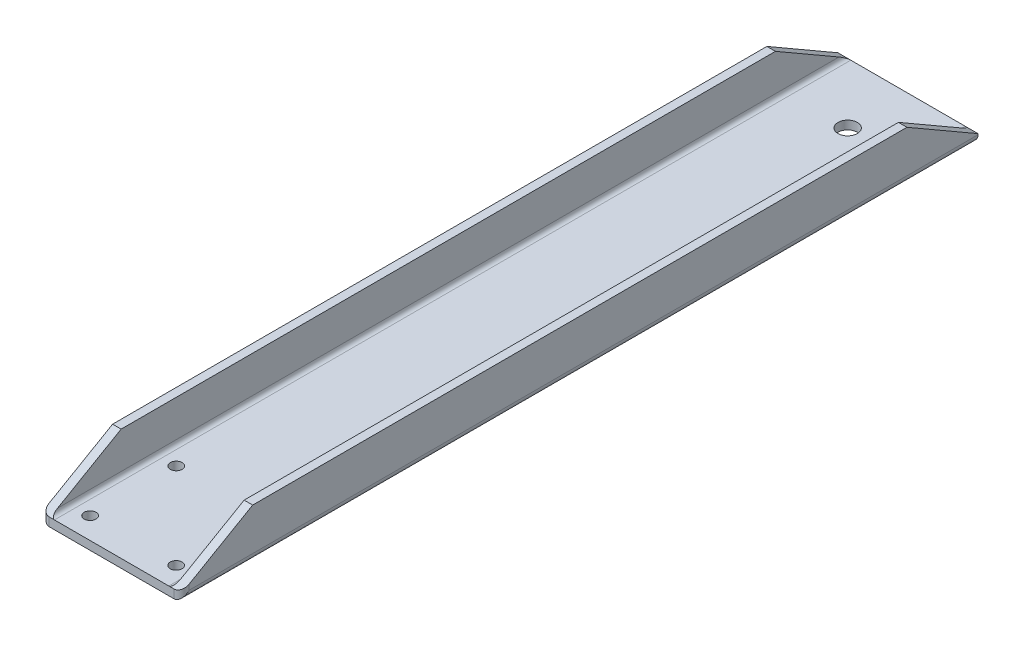
ISO-10303-21;
HEADER;
FILE_DESCRIPTION(('STEP AP214'),'2;1');
FILE_NAME('part.step','',(''),(''),'','','');
FILE_SCHEMA(('AUTOMOTIVE_DESIGN { 1 0 10303 214 1 1 1 1 }'));
ENDSEC;
DATA;
#1=APPLICATION_CONTEXT('core data for automotive mechanical design processes');
#2=APPLICATION_PROTOCOL_DEFINITION('international standard','automotive_design',2000,#1);
#3=PRODUCT_CONTEXT('',#1,'mechanical');
#4=PRODUCT('Part','Part','',(#3));
#5=PRODUCT_RELATED_PRODUCT_CATEGORY('part','',(#4));
#6=PRODUCT_DEFINITION_FORMATION('','',#4);
#7=PRODUCT_DEFINITION_CONTEXT('part definition',#1,'design');
#8=PRODUCT_DEFINITION('design','',#6,#7);
#9=PRODUCT_DEFINITION_SHAPE('','',#8);
#10=(LENGTH_UNIT() NAMED_UNIT(*) SI_UNIT(.MILLI.,.METRE.));
#11=(NAMED_UNIT(*) PLANE_ANGLE_UNIT() SI_UNIT($,.RADIAN.));
#12=(NAMED_UNIT(*) SI_UNIT($,.STERADIAN.) SOLID_ANGLE_UNIT());
#13=UNCERTAINTY_MEASURE_WITH_UNIT(LENGTH_MEASURE(1.E-05),#10,'distance_accuracy_value','');
#14=(GEOMETRIC_REPRESENTATION_CONTEXT(3) GLOBAL_UNCERTAINTY_ASSIGNED_CONTEXT((#13)) GLOBAL_UNIT_ASSIGNED_CONTEXT((#10,
#11,#12)) REPRESENTATION_CONTEXT('',''));
#15=CARTESIAN_POINT('',(0.,0.,0.));
#16=DIRECTION('',(0.,0.,1.));
#17=DIRECTION('',(1.,0.,0.));
#18=AXIS2_PLACEMENT_3D('',#15,#16,#17);
#19=CARTESIAN_POINT('',(32.54375,0.,370.));
#20=DIRECTION('',(-1.,0.,0.));
#21=DIRECTION('',(0.,0.,1.));
#22=AXIS2_PLACEMENT_3D('',#19,#20,#21);
#23=PLANE('',#22);
#24=DIRECTION('',(0.,-1.,0.));
#25=VECTOR('',#24,1.);
#26=CARTESIAN_POINT('',(32.54375,23.01875,366.5));
#27=LINE('',#26,#25);
#28=CARTESIAN_POINT('',(32.54375,5.9894759421637,366.5));
#29=VERTEX_POINT('',#28);
#30=CARTESIAN_POINT('',(32.54375,3.5,366.5));
#31=VERTEX_POINT('',#30);
#32=EDGE_CURVE('E140',#29,#31,#27,.T.);
#33=ORIENTED_EDGE('',*,*,#32,.T.);
#34=DIRECTION('',(0.,0.,-1.));
#35=VECTOR('',#34,1.);
#36=CARTESIAN_POINT('',(32.54375,3.5,370.));
#37=LINE('',#36,#35);
#38=CARTESIAN_POINT('',(32.54375,3.5,0.));
#39=VERTEX_POINT('',#38);
#40=EDGE_CURVE('E241',#31,#39,#37,.T.);
#41=ORIENTED_EDGE('',*,*,#40,.T.);
#42=DIRECTION('',(0.,1.,0.));
#43=VECTOR('',#42,1.);
#44=CARTESIAN_POINT('',(32.54375,0.,0.));
#45=LINE('',#44,#43);
#46=CARTESIAN_POINT('',(32.54375,3.96874999999999,0.));
#47=VERTEX_POINT('',#46);
#48=EDGE_CURVE('E198',#39,#47,#45,.T.);
#49=ORIENTED_EDGE('',*,*,#48,.T.);
#50=DIRECTION('',(0.,0.499999999999995,0.866025403784441));
#51=VECTOR('',#50,1.);
#52=CARTESIAN_POINT('',(32.54375,3.96874999999999,0.));
#53=LINE('',#52,#51);
#54=CARTESIAN_POINT('',(32.54375,23.01875,32.9955678841875));
#55=VERTEX_POINT('',#54);
#56=EDGE_CURVE('E177',#47,#55,#53,.T.);
#57=ORIENTED_EDGE('',*,*,#56,.T.);
#58=DIRECTION('',(0.,0.,-1.));
#59=VECTOR('',#58,1.);
#60=CARTESIAN_POINT('',(32.54375,23.01875,370.));
#61=LINE('',#60,#59);
#62=CARTESIAN_POINT('',(32.54375,23.01875,337.004432115813));
#63=VERTEX_POINT('',#62);
#64=EDGE_CURVE('E159',#63,#55,#61,.T.);
#65=ORIENTED_EDGE('',*,*,#64,.F.);
#66=DIRECTION('',(0.,-0.499999999999995,0.866025403784441));
#67=VECTOR('',#66,1.);
#68=CARTESIAN_POINT('',(32.54375,3.96875000000004,370.));
#69=LINE('',#68,#67);
#70=EDGE_CURVE('E152',#63,#29,#69,.T.);
#71=ORIENTED_EDGE('',*,*,#70,.T.);
#72=EDGE_LOOP('',(#33,#41,#49,#57,#65,#71));
#73=FACE_BOUND('',#72,.T.);
#74=ADVANCED_FACE('F36',(#73),#23,.F.);
#75=CARTESIAN_POINT('',(0.,0.,370.));
#76=DIRECTION('',(0.,0.,1.));
#77=DIRECTION('',(1.,0.,0.));
#78=AXIS2_PLACEMENT_3D('',#75,#76,#77);
#79=PLANE('',#78);
#80=DIRECTION('',(1.,0.,0.));
#81=VECTOR('',#80,1.);
#82=CARTESIAN_POINT('',(0.,0.,370.));
#83=LINE('',#82,#81);
#84=CARTESIAN_POINT('',(-29.04375,0.,370.));
#85=VERTEX_POINT('',#84);
#86=CARTESIAN_POINT('',(29.04375,0.,370.));
#87=VERTEX_POINT('',#86);
#88=EDGE_CURVE('E197',#85,#87,#83,.T.);
#89=ORIENTED_EDGE('',*,*,#88,.T.);
#90=DIRECTION('',(0.,-1.,0.));
#91=VECTOR('',#90,1.);
#92=CARTESIAN_POINT('',(29.04375,23.01875,370.));
#93=LINE('',#92,#91);
#94=CARTESIAN_POINT('',(29.04375,3.96875000000004,370.));
#95=VERTEX_POINT('',#94);
#96=EDGE_CURVE('E58',#95,#87,#93,.T.);
#97=ORIENTED_EDGE('',*,*,#96,.F.);
#98=DIRECTION('',(-1.,0.,0.));
#99=VECTOR('',#98,1.);
#100=CARTESIAN_POINT('',(32.54375,3.96875000000004,370.));
#101=LINE('',#100,#99);
#102=CARTESIAN_POINT('',(26.575,3.96874999999999,370.));
#103=VERTEX_POINT('',#102);
#104=EDGE_CURVE('E155',#95,#103,#101,.T.);
#105=ORIENTED_EDGE('',*,*,#104,.T.);
#106=DIRECTION('',(-1.,0.,0.));
#107=VECTOR('',#106,1.);
#108=CARTESIAN_POINT('',(0.,3.96874999999999,370.));
#109=LINE('',#108,#107);
#110=CARTESIAN_POINT('',(-26.575,3.96875000000004,370.));
#111=VERTEX_POINT('',#110);
#112=EDGE_CURVE('E194',#103,#111,#109,.T.);
#113=ORIENTED_EDGE('',*,*,#112,.T.);
#114=DIRECTION('',(1.,0.,0.));
#115=VECTOR('',#114,1.);
#116=CARTESIAN_POINT('',(0.,3.96875000000004,370.));
#117=LINE('',#116,#115);
#118=CARTESIAN_POINT('',(-29.04375,3.96875000000004,370.));
#119=VERTEX_POINT('',#118);
#120=EDGE_CURVE('E219',#119,#111,#117,.T.);
#121=ORIENTED_EDGE('',*,*,#120,.F.);
#122=DIRECTION('',(0.,-1.,0.));
#123=VECTOR('',#122,1.);
#124=CARTESIAN_POINT('',(-29.04375,23.01875,370.));
#125=LINE('',#124,#123);
#126=EDGE_CURVE('E257',#119,#85,#125,.T.);
#127=ORIENTED_EDGE('',*,*,#126,.T.);
#128=EDGE_LOOP('',(#89,#97,#105,#113,#121,#127));
#129=FACE_BOUND('',#128,.T.);
#130=ADVANCED_FACE('F265',(#129),#79,.T.);
#131=CARTESIAN_POINT('',(0.,3.96874999999999,370.));
#132=DIRECTION('',(0.,-1.,0.));
#133=DIRECTION('',(0.,0.,-1.));
#134=AXIS2_PLACEMENT_3D('',#131,#132,#133);
#135=PLANE('',#134);
#136=CARTESIAN_POINT('',(0.,3.96874999999999,28.));
#137=DIRECTION('',(0.,1.,0.));
#138=DIRECTION('',(0.,0.,1.));
#139=AXIS2_PLACEMENT_3D('',#136,#137,#138);
#140=CIRCLE('',#139,4.5);
#141=CARTESIAN_POINT('',(0.,3.96874999999999,32.5));
#142=VERTEX_POINT('',#141);
#143=EDGE_CURVE('E307',#142,#142,#140,.T.);
#144=ORIENTED_EDGE('',*,*,#143,.F.);
#145=EDGE_LOOP('',(#144));
#146=FACE_BOUND('',#145,.T.);
#147=CARTESIAN_POINT('',(20.,3.96874999999999,360.));
#148=DIRECTION('',(0.,1.,0.));
#149=DIRECTION('',(0.,0.,1.));
#150=AXIS2_PLACEMENT_3D('',#147,#148,#149);
#151=CIRCLE('',#150,2.74999999999999);
#152=CARTESIAN_POINT('',(20.,3.96874999999999,362.75));
#153=VERTEX_POINT('',#152);
#154=EDGE_CURVE('E313',#153,#153,#151,.T.);
#155=ORIENTED_EDGE('',*,*,#154,.F.);
#156=EDGE_LOOP('',(#155));
#157=FACE_BOUND('',#156,.T.);
#158=CARTESIAN_POINT('',(20.,3.96874999999999,320.));
#159=DIRECTION('',(0.,1.,0.));
#160=DIRECTION('',(0.,0.,1.));
#161=AXIS2_PLACEMENT_3D('',#158,#159,#160);
#162=CIRCLE('',#161,2.74999999999999);
#163=CARTESIAN_POINT('',(20.,3.96874999999999,322.75));
#164=VERTEX_POINT('',#163);
#165=EDGE_CURVE('E319',#164,#164,#162,.T.);
#166=ORIENTED_EDGE('',*,*,#165,.F.);
#167=EDGE_LOOP('',(#166));
#168=FACE_BOUND('',#167,.T.);
#169=CARTESIAN_POINT('',(-20.,3.96874999999999,320.));
#170=DIRECTION('',(0.,1.,0.));
#171=DIRECTION('',(0.,0.,1.));
#172=AXIS2_PLACEMENT_3D('',#169,#170,#171);
#173=CIRCLE('',#172,2.74999999999999);
#174=CARTESIAN_POINT('',(-20.,3.96874999999999,322.75));
#175=VERTEX_POINT('',#174);
#176=EDGE_CURVE('E325',#175,#175,#173,.T.);
#177=ORIENTED_EDGE('',*,*,#176,.F.);
#178=EDGE_LOOP('',(#177));
#179=FACE_BOUND('',#178,.T.);
#180=ORIENTED_EDGE('',*,*,#112,.F.);
#181=DIRECTION('',(0.,0.,-1.));
#182=VECTOR('',#181,1.);
#183=CARTESIAN_POINT('',(26.575,3.96874999999999,0.));
#184=LINE('',#183,#182);
#185=CARTESIAN_POINT('',(26.575,3.96874999999999,0.));
#186=VERTEX_POINT('',#185);
#187=EDGE_CURVE('E224',#103,#186,#184,.T.);
#188=ORIENTED_EDGE('',*,*,#187,.T.);
#189=DIRECTION('',(-1.,0.,0.));
#190=VECTOR('',#189,1.);
#191=CARTESIAN_POINT('',(0.,3.96874999999999,0.));
#192=LINE('',#191,#190);
#193=CARTESIAN_POINT('',(-26.575,3.96874999999999,0.));
#194=VERTEX_POINT('',#193);
#195=EDGE_CURVE('E193',#186,#194,#192,.T.);
#196=ORIENTED_EDGE('',*,*,#195,.T.);
#197=DIRECTION('',(0.,0.,-1.));
#198=VECTOR('',#197,1.);
#199=CARTESIAN_POINT('',(-26.575,3.96874999999999,370.));
#200=LINE('',#199,#198);
#201=EDGE_CURVE('E221',#194,#111,#200,.F.);
#202=ORIENTED_EDGE('',*,*,#201,.T.);
#203=EDGE_LOOP('',(#180,#188,#196,#202));
#204=FACE_BOUND('',#203,.T.);
#205=CARTESIAN_POINT('',(-20.,3.96874999999999,360.));
#206=DIRECTION('',(0.,1.,0.));
#207=DIRECTION('',(0.,0.,1.));
#208=AXIS2_PLACEMENT_3D('',#205,#206,#207);
#209=CIRCLE('',#208,2.74999999999999);
#210=CARTESIAN_POINT('',(-20.,3.96874999999999,362.75));
#211=VERTEX_POINT('',#210);
#212=EDGE_CURVE('E330',#211,#211,#209,.T.);
#213=ORIENTED_EDGE('',*,*,#212,.F.);
#214=EDGE_LOOP('',(#213));
#215=FACE_BOUND('',#214,.T.);
#216=ADVANCED_FACE('F300',(#146,#157,#168,#179,#204,#215),#135,.F.);
#217=CARTESIAN_POINT('',(-28.575,0.,370.));
#218=DIRECTION('',(1.,0.,0.));
#219=DIRECTION('',(0.,1.,0.));
#220=AXIS2_PLACEMENT_3D('',#217,#218,#219);
#221=PLANE('',#220);
#222=DIRECTION('',(0.,0.499999999999995,-0.866025403784441));
#223=VECTOR('',#222,1.);
#224=CARTESIAN_POINT('',(-28.575,2.97656250000005,371.718519160635));
#225=LINE('',#224,#223);
#226=CARTESIAN_POINT('',(-28.575,5.96874999999999,366.535898384862));
#227=VERTEX_POINT('',#226);
#228=CARTESIAN_POINT('',(-28.575,23.01875,337.004432115813));
#229=VERTEX_POINT('',#228);
#230=EDGE_CURVE('E174',#227,#229,#225,.T.);
#231=ORIENTED_EDGE('',*,*,#230,.F.);
#232=DIRECTION('',(0.,0.,-1.));
#233=VECTOR('',#232,1.);
#234=CARTESIAN_POINT('',(-28.575,5.96874999999999,370.));
#235=LINE('',#234,#233);
#236=CARTESIAN_POINT('',(-28.575,5.96874999999997,3.46410161513772));
#237=VERTEX_POINT('',#236);
#238=EDGE_CURVE('E229',#227,#237,#235,.T.);
#239=ORIENTED_EDGE('',*,*,#238,.T.);
#240=DIRECTION('',(0.,-0.499999999999995,-0.866025403784441));
#241=VECTOR('',#240,1.);
#242=CARTESIAN_POINT('',(-28.575,163.19126220012,275.781480839367));
#243=LINE('',#242,#241);
#244=CARTESIAN_POINT('',(-28.575,23.01875,32.9955678841875));
#245=VERTEX_POINT('',#244);
#246=EDGE_CURVE('E190',#245,#237,#243,.T.);
#247=ORIENTED_EDGE('',*,*,#246,.F.);
#248=DIRECTION('',(0.,0.,-1.));
#249=VECTOR('',#248,1.);
#250=CARTESIAN_POINT('',(-28.575,23.01875,370.));
#251=LINE('',#250,#249);
#252=EDGE_CURVE('E215',#229,#245,#251,.T.);
#253=ORIENTED_EDGE('',*,*,#252,.F.);
#254=EDGE_LOOP('',(#231,#239,#247,#253));
#255=FACE_BOUND('',#254,.T.);
#256=ADVANCED_FACE('F292',(#255),#221,.T.);
#257=CARTESIAN_POINT('',(0.,23.01875,370.));
#258=DIRECTION('',(0.,1.,0.));
#259=DIRECTION('',(0.,0.,1.));
#260=AXIS2_PLACEMENT_3D('',#257,#258,#259);
#261=PLANE('',#260);
#262=DIRECTION('',(-1.,0.,0.));
#263=VECTOR('',#262,1.);
#264=CARTESIAN_POINT('',(32.54375,23.01875,337.004432115813));
#265=LINE('',#264,#263);
#266=CARTESIAN_POINT('',(-32.54375,23.01875,337.004432115813));
#267=VERTEX_POINT('',#266);
#268=EDGE_CURVE('E160',#229,#267,#265,.T.);
#269=ORIENTED_EDGE('',*,*,#268,.F.);
#270=ORIENTED_EDGE('',*,*,#252,.T.);
#271=DIRECTION('',(-1.,0.,0.));
#272=VECTOR('',#271,1.);
#273=CARTESIAN_POINT('',(32.54375,23.01875,32.9955678841875));
#274=LINE('',#273,#272);
#275=CARTESIAN_POINT('',(-32.54375,23.01875,32.9955678841875));
#276=VERTEX_POINT('',#275);
#277=EDGE_CURVE('E186',#245,#276,#274,.T.);
#278=ORIENTED_EDGE('',*,*,#277,.T.);
#279=DIRECTION('',(0.,0.,-1.));
#280=VECTOR('',#279,1.);
#281=CARTESIAN_POINT('',(-32.54375,23.01875,370.));
#282=LINE('',#281,#280);
#283=EDGE_CURVE('E213',#267,#276,#282,.T.);
#284=ORIENTED_EDGE('',*,*,#283,.F.);
#285=EDGE_LOOP('',(#269,#270,#278,#284));
#286=FACE_BOUND('',#285,.T.);
#287=ADVANCED_FACE('F288',(#286),#261,.T.);
#288=CARTESIAN_POINT('',(-32.54375,0.,370.));
#289=DIRECTION('',(1.,0.,0.));
#290=DIRECTION('',(0.,0.,-1.));
#291=AXIS2_PLACEMENT_3D('',#288,#289,#290);
#292=PLANE('',#291);
#293=DIRECTION('',(0.,0.,-1.));
#294=VECTOR('',#293,1.);
#295=CARTESIAN_POINT('',(-32.54375,3.5,370.));
#296=LINE('',#295,#294);
#297=CARTESIAN_POINT('',(-32.54375,3.5,0.));
#298=VERTEX_POINT('',#297);
#299=CARTESIAN_POINT('',(-32.54375,3.5,366.5));
#300=VERTEX_POINT('',#299);
#301=EDGE_CURVE('E253',#298,#300,#296,.F.);
#302=ORIENTED_EDGE('',*,*,#301,.T.);
#303=DIRECTION('',(0.,-1.,0.));
#304=VECTOR('',#303,1.);
#305=CARTESIAN_POINT('',(-32.54375,23.01875,366.5));
#306=LINE('',#305,#304);
#307=CARTESIAN_POINT('',(-32.54375,5.98947594216371,366.5));
#308=VERTEX_POINT('',#307);
#309=EDGE_CURVE('E51',#308,#300,#306,.T.);
#310=ORIENTED_EDGE('',*,*,#309,.F.);
#311=DIRECTION('',(0.,-0.499999999999995,0.866025403784441));
#312=VECTOR('',#311,1.);
#313=CARTESIAN_POINT('',(-32.54375,3.96875000000004,370.));
#314=LINE('',#313,#312);
#315=EDGE_CURVE('E161',#267,#308,#314,.T.);
#316=ORIENTED_EDGE('',*,*,#315,.F.);
#317=ORIENTED_EDGE('',*,*,#283,.T.);
#318=DIRECTION('',(0.,0.499999999999995,0.866025403784441));
#319=VECTOR('',#318,1.);
#320=CARTESIAN_POINT('',(-32.54375,3.96874999999999,0.));
#321=LINE('',#320,#319);
#322=CARTESIAN_POINT('',(-32.54375,3.96874999999999,0.));
#323=VERTEX_POINT('',#322);
#324=EDGE_CURVE('E176',#323,#276,#321,.T.);
#325=ORIENTED_EDGE('',*,*,#324,.F.);
#326=DIRECTION('',(0.,-1.,0.));
#327=VECTOR('',#326,1.);
#328=CARTESIAN_POINT('',(-32.54375,0.,0.));
#329=LINE('',#328,#327);
#330=EDGE_CURVE('E204',#323,#298,#329,.T.);
#331=ORIENTED_EDGE('',*,*,#330,.T.);
#332=EDGE_LOOP('',(#302,#310,#316,#317,#325,#331));
#333=FACE_BOUND('',#332,.T.);
#334=ADVANCED_FACE('F278',(#333),#292,.F.);
#335=CARTESIAN_POINT('',(0.,0.,370.));
#336=DIRECTION('',(0.,1.,0.));
#337=DIRECTION('',(0.,0.,1.));
#338=AXIS2_PLACEMENT_3D('',#335,#336,#337);
#339=PLANE('',#338);
#340=CARTESIAN_POINT('',(0.,0.,28.));
#341=DIRECTION('',(0.,1.,0.));
#342=DIRECTION('',(0.,0.,1.));
#343=AXIS2_PLACEMENT_3D('',#340,#341,#342);
#344=CIRCLE('',#343,4.5);
#345=CARTESIAN_POINT('',(0.,0.,32.5));
#346=VERTEX_POINT('',#345);
#347=EDGE_CURVE('E310',#346,#346,#344,.T.);
#348=ORIENTED_EDGE('',*,*,#347,.T.);
#349=EDGE_LOOP('',(#348));
#350=FACE_BOUND('',#349,.T.);
#351=CARTESIAN_POINT('',(20.,0.,360.));
#352=DIRECTION('',(0.,1.,0.));
#353=DIRECTION('',(0.,0.,1.));
#354=AXIS2_PLACEMENT_3D('',#351,#352,#353);
#355=CIRCLE('',#354,2.75);
#356=CARTESIAN_POINT('',(20.,0.,362.75));
#357=VERTEX_POINT('',#356);
#358=EDGE_CURVE('E316',#357,#357,#355,.T.);
#359=ORIENTED_EDGE('',*,*,#358,.T.);
#360=EDGE_LOOP('',(#359));
#361=FACE_BOUND('',#360,.T.);
#362=CARTESIAN_POINT('',(20.,0.,320.));
#363=DIRECTION('',(0.,1.,0.));
#364=DIRECTION('',(0.,0.,1.));
#365=AXIS2_PLACEMENT_3D('',#362,#363,#364);
#366=CIRCLE('',#365,2.75);
#367=CARTESIAN_POINT('',(20.,0.,322.75));
#368=VERTEX_POINT('',#367);
#369=EDGE_CURVE('E322',#368,#368,#366,.T.);
#370=ORIENTED_EDGE('',*,*,#369,.T.);
#371=EDGE_LOOP('',(#370));
#372=FACE_BOUND('',#371,.T.);
#373=CARTESIAN_POINT('',(-20.,0.,320.));
#374=DIRECTION('',(0.,1.,0.));
#375=DIRECTION('',(0.,0.,1.));
#376=AXIS2_PLACEMENT_3D('',#373,#374,#375);
#377=CIRCLE('',#376,2.75);
#378=CARTESIAN_POINT('',(-20.,0.,322.75));
#379=VERTEX_POINT('',#378);
#380=EDGE_CURVE('E328',#379,#379,#377,.T.);
#381=ORIENTED_EDGE('',*,*,#380,.T.);
#382=EDGE_LOOP('',(#381));
#383=FACE_BOUND('',#382,.T.);
#384=CARTESIAN_POINT('',(-20.,0.,360.));
#385=DIRECTION('',(0.,1.,0.));
#386=DIRECTION('',(0.,0.,1.));
#387=AXIS2_PLACEMENT_3D('',#384,#385,#386);
#388=CIRCLE('',#387,2.75);
#389=CARTESIAN_POINT('',(-20.,0.,362.75));
#390=VERTEX_POINT('',#389);
#391=EDGE_CURVE('E166',#390,#390,#388,.T.);
#392=ORIENTED_EDGE('',*,*,#391,.T.);
#393=EDGE_LOOP('',(#392));
#394=FACE_BOUND('',#393,.T.);
#395=DIRECTION('',(1.,0.,0.));
#396=VECTOR('',#395,1.);
#397=CARTESIAN_POINT('',(0.,0.,0.));
#398=LINE('',#397,#396);
#399=CARTESIAN_POINT('',(-29.04375,0.,0.));
#400=VERTEX_POINT('',#399);
#401=CARTESIAN_POINT('',(29.04375,0.,0.));
#402=VERTEX_POINT('',#401);
#403=EDGE_CURVE('E207',#400,#402,#398,.T.);
#404=ORIENTED_EDGE('',*,*,#403,.T.);
#405=DIRECTION('',(0.,0.,-1.));
#406=VECTOR('',#405,1.);
#407=CARTESIAN_POINT('',(29.04375,0.,370.));
#408=LINE('',#407,#406);
#409=EDGE_CURVE('E250',#402,#87,#408,.F.);
#410=ORIENTED_EDGE('',*,*,#409,.T.);
#411=ORIENTED_EDGE('',*,*,#88,.F.);
#412=DIRECTION('',(0.,0.,-1.));
#413=VECTOR('',#412,1.);
#414=CARTESIAN_POINT('',(-29.04375,0.,370.));
#415=LINE('',#414,#413);
#416=EDGE_CURVE('E247',#85,#400,#415,.T.);
#417=ORIENTED_EDGE('',*,*,#416,.T.);
#418=EDGE_LOOP('',(#404,#410,#411,#417));
#419=FACE_BOUND('',#418,.T.);
#420=ADVANCED_FACE('F269',(#350,#361,#372,#383,#394,#419),#339,.F.);
#421=CARTESIAN_POINT('',(0.,23.01875,370.));
#422=DIRECTION('',(0.,-1.,0.));
#423=DIRECTION('',(0.,0.,-1.));
#424=AXIS2_PLACEMENT_3D('',#421,#422,#423);
#425=PLANE('',#424);
#426=DIRECTION('',(0.,0.,-1.));
#427=VECTOR('',#426,1.);
#428=CARTESIAN_POINT('',(28.575,23.01875,370.));
#429=LINE('',#428,#427);
#430=CARTESIAN_POINT('',(28.575,23.01875,337.004432115813));
#431=VERTEX_POINT('',#430);
#432=CARTESIAN_POINT('',(28.575,23.01875,32.9955678841875));
#433=VERTEX_POINT('',#432);
#434=EDGE_CURVE('E201',#431,#433,#429,.T.);
#435=ORIENTED_EDGE('',*,*,#434,.F.);
#436=EDGE_CURVE('E163',#63,#431,#265,.T.);
#437=ORIENTED_EDGE('',*,*,#436,.F.);
#438=ORIENTED_EDGE('',*,*,#64,.T.);
#439=EDGE_CURVE('E182',#55,#433,#274,.T.);
#440=ORIENTED_EDGE('',*,*,#439,.T.);
#441=EDGE_LOOP('',(#435,#437,#438,#440));
#442=FACE_BOUND('',#441,.T.);
#443=ADVANCED_FACE('F360',(#442),#425,.F.);
#444=CARTESIAN_POINT('',(28.575,0.,370.));
#445=DIRECTION('',(1.,0.,0.));
#446=DIRECTION('',(0.,1.,0.));
#447=AXIS2_PLACEMENT_3D('',#444,#445,#446);
#448=PLANE('',#447);
#449=DIRECTION('',(0.,-0.499999999999995,-0.866025403784441));
#450=VECTOR('',#449,1.);
#451=CARTESIAN_POINT('',(28.575,163.19126220012,275.781480839367));
#452=LINE('',#451,#450);
#453=CARTESIAN_POINT('',(28.575,5.96874999999997,3.46410161513772));
#454=VERTEX_POINT('',#453);
#455=EDGE_CURVE('E185',#433,#454,#452,.T.);
#456=ORIENTED_EDGE('',*,*,#455,.T.);
#457=DIRECTION('',(0.,0.,-1.));
#458=VECTOR('',#457,1.);
#459=CARTESIAN_POINT('',(28.575,5.96874999999999,370.));
#460=LINE('',#459,#458);
#461=CARTESIAN_POINT('',(28.575,5.96874999999999,366.535898384862));
#462=VERTEX_POINT('',#461);
#463=EDGE_CURVE('E227',#454,#462,#460,.F.);
#464=ORIENTED_EDGE('',*,*,#463,.T.);
#465=DIRECTION('',(0.,0.499999999999995,-0.866025403784441));
#466=VECTOR('',#465,1.);
#467=CARTESIAN_POINT('',(28.575,2.97656250000005,371.718519160635));
#468=LINE('',#467,#466);
#469=EDGE_CURVE('E171',#462,#431,#468,.T.);
#470=ORIENTED_EDGE('',*,*,#469,.T.);
#471=ORIENTED_EDGE('',*,*,#434,.T.);
#472=EDGE_LOOP('',(#456,#464,#470,#471));
#473=FACE_BOUND('',#472,.T.);
#474=ADVANCED_FACE('F401',(#473),#448,.F.);
#475=CARTESIAN_POINT('',(0.,0.,0.));
#476=DIRECTION('',(0.,0.,1.));
#477=DIRECTION('',(1.,0.,0.));
#478=AXIS2_PLACEMENT_3D('',#475,#476,#477);
#479=PLANE('',#478);
#480=ORIENTED_EDGE('',*,*,#48,.F.);
#481=CARTESIAN_POINT('',(29.04375,3.5,0.));
#482=DIRECTION('',(0.,0.,1.));
#483=DIRECTION('',(1.,0.,0.));
#484=AXIS2_PLACEMENT_3D('',#481,#482,#483);
#485=CIRCLE('',#484,3.5);
#486=EDGE_CURVE('E245',#39,#402,#485,.F.);
#487=ORIENTED_EDGE('',*,*,#486,.T.);
#488=ORIENTED_EDGE('',*,*,#403,.F.);
#489=CARTESIAN_POINT('',(-29.04375,3.5,0.));
#490=DIRECTION('',(0.,0.,1.));
#491=DIRECTION('',(1.,0.,0.));
#492=AXIS2_PLACEMENT_3D('',#489,#490,#491);
#493=CIRCLE('',#492,3.5);
#494=EDGE_CURVE('E243',#400,#298,#493,.F.);
#495=ORIENTED_EDGE('',*,*,#494,.T.);
#496=ORIENTED_EDGE('',*,*,#330,.F.);
#497=DIRECTION('',(1.,0.,0.));
#498=VECTOR('',#497,1.);
#499=CARTESIAN_POINT('',(0.,3.96874999999999,0.));
#500=LINE('',#499,#498);
#501=EDGE_CURVE('E217',#323,#194,#500,.T.);
#502=ORIENTED_EDGE('',*,*,#501,.T.);
#503=ORIENTED_EDGE('',*,*,#195,.F.);
#504=DIRECTION('',(-1.,0.,0.));
#505=VECTOR('',#504,1.);
#506=CARTESIAN_POINT('',(32.54375,3.96874999999999,0.));
#507=LINE('',#506,#505);
#508=EDGE_CURVE('E179',#47,#186,#507,.T.);
#509=ORIENTED_EDGE('',*,*,#508,.F.);
#510=EDGE_LOOP('',(#480,#487,#488,#495,#496,#502,#503,#509));
#511=FACE_BOUND('',#510,.T.);
#512=ADVANCED_FACE('F275',(#511),#479,.F.);
#513=CARTESIAN_POINT('',(32.54375,3.96874999999999,0.));
#514=DIRECTION('',(0.,-0.866025403784441,0.499999999999995));
#515=DIRECTION('',(0.,-0.499999999999995,-0.866025403784441));
#516=AXIS2_PLACEMENT_3D('',#513,#514,#515);
#517=PLANE('',#516);
#518=ORIENTED_EDGE('',*,*,#439,.F.);
#519=ORIENTED_EDGE('',*,*,#56,.F.);
#520=ORIENTED_EDGE('',*,*,#508,.T.);
#521=CARTESIAN_POINT('',(26.575,5.96874999999999,3.46410161513783));
#522=DIRECTION('',(0.,-0.866025403784441,0.499999999999995));
#523=DIRECTION('',(0.,0.499999999999995,0.866025403784441));
#524=AXIS2_PLACEMENT_3D('',#521,#522,#523);
#525=ELLIPSE('',#524,4.00000000000004,2.);
#526=EDGE_CURVE('E232',#186,#454,#525,.T.);
#527=ORIENTED_EDGE('',*,*,#526,.T.);
#528=ORIENTED_EDGE('',*,*,#455,.F.);
#529=EDGE_LOOP('',(#518,#519,#520,#527,#528));
#530=FACE_BOUND('',#529,.T.);
#531=ADVANCED_FACE('F391',(#530),#517,.F.);
#532=ORIENTED_EDGE('',*,*,#246,.T.);
#533=CARTESIAN_POINT('',(-26.575,5.96874999999999,3.46410161513783));
#534=DIRECTION('',(0.,-0.866025403784441,0.499999999999995));
#535=DIRECTION('',(0.,-0.499999999999995,-0.866025403784441));
#536=AXIS2_PLACEMENT_3D('',#533,#534,#535);
#537=ELLIPSE('',#536,4.00000000000004,2.);
#538=EDGE_CURVE('E236',#237,#194,#537,.T.);
#539=ORIENTED_EDGE('',*,*,#538,.T.);
#540=ORIENTED_EDGE('',*,*,#501,.F.);
#541=ORIENTED_EDGE('',*,*,#324,.T.);
#542=ORIENTED_EDGE('',*,*,#277,.F.);
#543=EDGE_LOOP('',(#532,#539,#540,#541,#542));
#544=FACE_BOUND('',#543,.T.);
#545=ADVANCED_FACE('F284',(#544),#517,.F.);
#546=CARTESIAN_POINT('',(32.54375,3.96875000000004,370.));
#547=DIRECTION('',(0.,-0.866025403784441,-0.499999999999995));
#548=DIRECTION('',(0.,0.499999999999995,-0.866025403784441));
#549=AXIS2_PLACEMENT_3D('',#546,#547,#548);
#550=PLANE('',#549);
#551=ORIENTED_EDGE('',*,*,#104,.F.);
#552=CARTESIAN_POINT('',(29.04375,5.98947594216371,366.5));
#553=DIRECTION('',(0.,-0.866025403784441,-0.499999999999995));
#554=DIRECTION('',(0.,-0.499999999999995,0.866025403784441));
#555=AXIS2_PLACEMENT_3D('',#552,#553,#554);
#556=ELLIPSE('',#555,4.04145188432737,3.5);
#557=EDGE_CURVE('E143',#95,#29,#556,.F.);
#558=ORIENTED_EDGE('',*,*,#557,.T.);
#559=ORIENTED_EDGE('',*,*,#70,.F.);
#560=ORIENTED_EDGE('',*,*,#436,.T.);
#561=ORIENTED_EDGE('',*,*,#469,.F.);
#562=CARTESIAN_POINT('',(26.575,5.96874999999999,366.535898384862));
#563=DIRECTION('',(0.,-0.866025403784441,-0.499999999999995));
#564=DIRECTION('',(0.,-0.499999999999995,0.866025403784441));
#565=AXIS2_PLACEMENT_3D('',#562,#563,#564);
#566=ELLIPSE('',#565,4.00000000000004,2.);
#567=EDGE_CURVE('E234',#462,#103,#566,.T.);
#568=ORIENTED_EDGE('',*,*,#567,.T.);
#569=EDGE_LOOP('',(#551,#558,#559,#560,#561,#568));
#570=FACE_BOUND('',#569,.T.);
#571=ADVANCED_FACE('F150',(#570),#550,.F.);
#572=ORIENTED_EDGE('',*,*,#315,.T.);
#573=CARTESIAN_POINT('',(-29.04375,5.98947594216371,366.5));
#574=DIRECTION('',(0.,-0.866025403784441,-0.499999999999995));
#575=DIRECTION('',(0.,-0.499999999999995,0.866025403784441));
#576=AXIS2_PLACEMENT_3D('',#573,#574,#575);
#577=ELLIPSE('',#576,4.04145188432737,3.5);
#578=EDGE_CURVE('E266',#308,#119,#577,.F.);
#579=ORIENTED_EDGE('',*,*,#578,.T.);
#580=ORIENTED_EDGE('',*,*,#120,.T.);
#581=CARTESIAN_POINT('',(-26.575,5.96874999999999,366.535898384862));
#582=DIRECTION('',(0.,-0.866025403784441,-0.499999999999995));
#583=DIRECTION('',(0.,0.499999999999995,-0.866025403784441));
#584=AXIS2_PLACEMENT_3D('',#581,#582,#583);
#585=ELLIPSE('',#584,4.00000000000004,2.);
#586=EDGE_CURVE('E239',#111,#227,#585,.T.);
#587=ORIENTED_EDGE('',*,*,#586,.T.);
#588=ORIENTED_EDGE('',*,*,#230,.T.);
#589=ORIENTED_EDGE('',*,*,#268,.T.);
#590=EDGE_LOOP('',(#572,#579,#580,#587,#588,#589));
#591=FACE_BOUND('',#590,.T.);
#592=ADVANCED_FACE('F341',(#591),#550,.F.);
#593=CARTESIAN_POINT('',(-20.,3.96874999999999,360.));
#594=DIRECTION('',(0.,1.,0.));
#595=DIRECTION('',(0.,0.,1.));
#596=AXIS2_PLACEMENT_3D('',#593,#594,#595);
#597=CYLINDRICAL_SURFACE('',#596,2.74999999999999);
#598=ORIENTED_EDGE('',*,*,#391,.F.);
#599=EDGE_LOOP('',(#598));
#600=FACE_BOUND('',#599,.T.);
#601=ORIENTED_EDGE('',*,*,#212,.T.);
#602=EDGE_LOOP('',(#601));
#603=FACE_BOUND('',#602,.T.);
#604=ADVANCED_FACE('F338',(#600,#603),#597,.F.);
#605=CARTESIAN_POINT('',(-20.,3.96874999999999,320.));
#606=DIRECTION('',(0.,1.,0.));
#607=DIRECTION('',(0.,0.,1.));
#608=AXIS2_PLACEMENT_3D('',#605,#606,#607);
#609=CYLINDRICAL_SURFACE('',#608,2.74999999999999);
#610=ORIENTED_EDGE('',*,*,#380,.F.);
#611=EDGE_LOOP('',(#610));
#612=FACE_BOUND('',#611,.T.);
#613=ORIENTED_EDGE('',*,*,#176,.T.);
#614=EDGE_LOOP('',(#613));
#615=FACE_BOUND('',#614,.T.);
#616=ADVANCED_FACE('F340',(#612,#615),#609,.F.);
#617=CARTESIAN_POINT('',(20.,3.96874999999999,320.));
#618=DIRECTION('',(0.,1.,0.));
#619=DIRECTION('',(0.,0.,1.));
#620=AXIS2_PLACEMENT_3D('',#617,#618,#619);
#621=CYLINDRICAL_SURFACE('',#620,2.74999999999999);
#622=ORIENTED_EDGE('',*,*,#369,.F.);
#623=EDGE_LOOP('',(#622));
#624=FACE_BOUND('',#623,.T.);
#625=ORIENTED_EDGE('',*,*,#165,.T.);
#626=EDGE_LOOP('',(#625));
#627=FACE_BOUND('',#626,.T.);
#628=ADVANCED_FACE('F347',(#624,#627),#621,.F.);
#629=CARTESIAN_POINT('',(20.,3.96874999999999,360.));
#630=DIRECTION('',(0.,1.,0.));
#631=DIRECTION('',(0.,0.,1.));
#632=AXIS2_PLACEMENT_3D('',#629,#630,#631);
#633=CYLINDRICAL_SURFACE('',#632,2.74999999999999);
#634=ORIENTED_EDGE('',*,*,#358,.F.);
#635=EDGE_LOOP('',(#634));
#636=FACE_BOUND('',#635,.T.);
#637=ORIENTED_EDGE('',*,*,#154,.T.);
#638=EDGE_LOOP('',(#637));
#639=FACE_BOUND('',#638,.T.);
#640=ADVANCED_FACE('F497',(#636,#639),#633,.F.);
#641=CARTESIAN_POINT('',(0.,3.96874999999999,28.));
#642=DIRECTION('',(0.,1.,0.));
#643=DIRECTION('',(0.,0.,1.));
#644=AXIS2_PLACEMENT_3D('',#641,#642,#643);
#645=CYLINDRICAL_SURFACE('',#644,4.5);
#646=ORIENTED_EDGE('',*,*,#347,.F.);
#647=EDGE_LOOP('',(#646));
#648=FACE_BOUND('',#647,.T.);
#649=ORIENTED_EDGE('',*,*,#143,.T.);
#650=EDGE_LOOP('',(#649));
#651=FACE_BOUND('',#650,.T.);
#652=ADVANCED_FACE('F377',(#648,#651),#645,.F.);
#653=CARTESIAN_POINT('',(26.575,5.96874999999999,370.));
#654=DIRECTION('',(0.,0.,1.));
#655=DIRECTION('',(1.,0.,0.));
#656=AXIS2_PLACEMENT_3D('',#653,#654,#655);
#657=CYLINDRICAL_SURFACE('',#656,2.);
#658=ORIENTED_EDGE('',*,*,#567,.F.);
#659=ORIENTED_EDGE('',*,*,#463,.F.);
#660=ORIENTED_EDGE('',*,*,#526,.F.);
#661=ORIENTED_EDGE('',*,*,#187,.F.);
#662=EDGE_LOOP('',(#658,#659,#660,#661));
#663=FACE_BOUND('',#662,.T.);
#664=ADVANCED_FACE('F374',(#663),#657,.F.);
#665=CARTESIAN_POINT('',(-26.575,5.96874999999999,370.));
#666=DIRECTION('',(0.,0.,-1.));
#667=DIRECTION('',(-1.,0.,0.));
#668=AXIS2_PLACEMENT_3D('',#665,#666,#667);
#669=CYLINDRICAL_SURFACE('',#668,2.);
#670=ORIENTED_EDGE('',*,*,#586,.F.);
#671=ORIENTED_EDGE('',*,*,#201,.F.);
#672=ORIENTED_EDGE('',*,*,#538,.F.);
#673=ORIENTED_EDGE('',*,*,#238,.F.);
#674=EDGE_LOOP('',(#670,#671,#672,#673));
#675=FACE_BOUND('',#674,.T.);
#676=ADVANCED_FACE('F297',(#675),#669,.F.);
#677=CARTESIAN_POINT('',(29.04375,3.5,370.));
#678=DIRECTION('',(0.,0.,-1.));
#679=DIRECTION('',(-1.,0.,0.));
#680=AXIS2_PLACEMENT_3D('',#677,#678,#679);
#681=CYLINDRICAL_SURFACE('',#680,3.5);
#682=CARTESIAN_POINT('',(29.04375,3.5,366.5));
#683=DIRECTION('',(0.,-0.707106781186547,-0.707106781186547));
#684=DIRECTION('',(0.,0.707106781186547,-0.707106781186547));
#685=AXIS2_PLACEMENT_3D('',#682,#683,#684);
#686=ELLIPSE('',#685,4.94974746830584,3.5);
#687=EDGE_CURVE('E11',#87,#31,#686,.F.);
#688=ORIENTED_EDGE('',*,*,#687,.F.);
#689=ORIENTED_EDGE('',*,*,#409,.F.);
#690=ORIENTED_EDGE('',*,*,#486,.F.);
#691=ORIENTED_EDGE('',*,*,#40,.F.);
#692=EDGE_LOOP('',(#688,#689,#690,#691));
#693=FACE_BOUND('',#692,.T.);
#694=ADVANCED_FACE('F380',(#693),#681,.T.);
#695=CARTESIAN_POINT('',(-29.04375,3.5,370.));
#696=DIRECTION('',(0.,0.,-1.));
#697=DIRECTION('',(-1.,0.,0.));
#698=AXIS2_PLACEMENT_3D('',#695,#696,#697);
#699=CYLINDRICAL_SURFACE('',#698,3.5);
#700=CARTESIAN_POINT('',(-29.04375,3.5,366.5));
#701=DIRECTION('',(0.,-0.707106781186547,-0.707106781186547));
#702=DIRECTION('',(0.,0.707106781186547,-0.707106781186547));
#703=AXIS2_PLACEMENT_3D('',#700,#701,#702);
#704=ELLIPSE('',#703,4.94974746830584,3.5);
#705=EDGE_CURVE('E44',#300,#85,#704,.F.);
#706=ORIENTED_EDGE('',*,*,#705,.F.);
#707=ORIENTED_EDGE('',*,*,#301,.F.);
#708=ORIENTED_EDGE('',*,*,#494,.F.);
#709=ORIENTED_EDGE('',*,*,#416,.F.);
#710=EDGE_LOOP('',(#706,#707,#708,#709));
#711=FACE_BOUND('',#710,.T.);
#712=ADVANCED_FACE('F38',(#711),#699,.T.);
#713=CARTESIAN_POINT('',(-29.04375,23.01875,366.5));
#714=DIRECTION('',(0.,-1.,0.));
#715=DIRECTION('',(0.,0.,-1.));
#716=AXIS2_PLACEMENT_3D('',#713,#714,#715);
#717=CYLINDRICAL_SURFACE('',#716,3.5);
#718=ORIENTED_EDGE('',*,*,#309,.T.);
#719=ORIENTED_EDGE('',*,*,#705,.T.);
#720=ORIENTED_EDGE('',*,*,#126,.F.);
#721=ORIENTED_EDGE('',*,*,#578,.F.);
#722=EDGE_LOOP('',(#718,#719,#720,#721));
#723=FACE_BOUND('',#722,.T.);
#724=ADVANCED_FACE('F256',(#723),#717,.T.);
#725=CARTESIAN_POINT('',(29.04375,23.01875,366.5));
#726=DIRECTION('',(0.,-1.,0.));
#727=DIRECTION('',(0.,0.,-1.));
#728=AXIS2_PLACEMENT_3D('',#725,#726,#727);
#729=CYLINDRICAL_SURFACE('',#728,3.5);
#730=ORIENTED_EDGE('',*,*,#96,.T.);
#731=ORIENTED_EDGE('',*,*,#687,.T.);
#732=ORIENTED_EDGE('',*,*,#32,.F.);
#733=ORIENTED_EDGE('',*,*,#557,.F.);
#734=EDGE_LOOP('',(#730,#731,#732,#733));
#735=FACE_BOUND('',#734,.T.);
#736=ADVANCED_FACE('F142',(#735),#729,.T.);
#737=CLOSED_SHELL('',(#74,#130,#216,#256,#287,#334,#420,#443,#474,#512,#531,#545,#571,#592,#604,
#616,#628,#640,#652,#664,#676,#694,#712,#724,#736));
#738=MANIFOLD_SOLID_BREP('B2',#737);
#739=ADVANCED_BREP_SHAPE_REPRESENTATION('',(#18,#738),#14);
#740=SHAPE_DEFINITION_REPRESENTATION(#9,#739);
ENDSEC;
END-ISO-10303-21;
